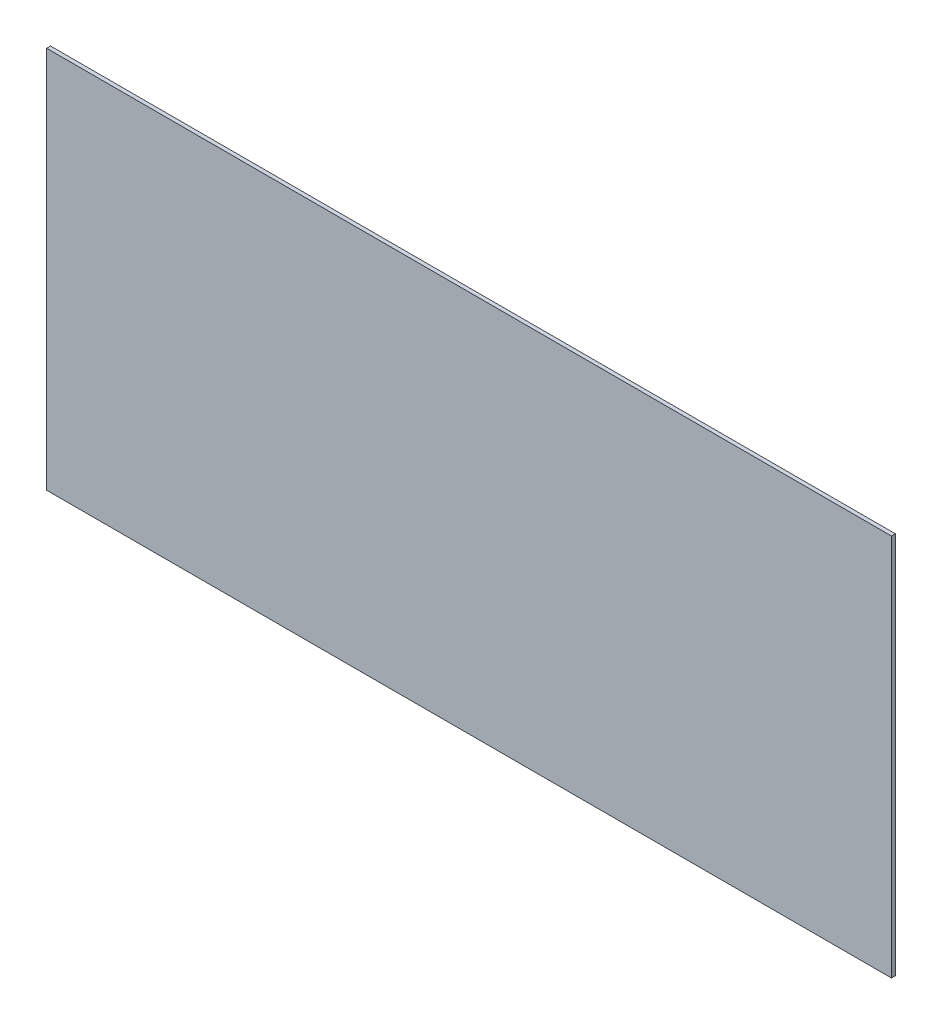
ISO-10303-21;
HEADER;
FILE_DESCRIPTION(('STEP AP214'),'2;1');
FILE_NAME('part.step','',(''),(''),'','','');
FILE_SCHEMA(('AUTOMOTIVE_DESIGN { 1 0 10303 214 1 1 1 1 }'));
ENDSEC;
DATA;
#1=APPLICATION_CONTEXT('core data for automotive mechanical design processes');
#2=APPLICATION_PROTOCOL_DEFINITION('international standard','automotive_design',2000,#1);
#3=PRODUCT_CONTEXT('',#1,'mechanical');
#4=PRODUCT('Part','Part','',(#3));
#5=PRODUCT_RELATED_PRODUCT_CATEGORY('part','',(#4));
#6=PRODUCT_DEFINITION_FORMATION('','',#4);
#7=PRODUCT_DEFINITION_CONTEXT('part definition',#1,'design');
#8=PRODUCT_DEFINITION('design','',#6,#7);
#9=PRODUCT_DEFINITION_SHAPE('','',#8);
#10=(LENGTH_UNIT() NAMED_UNIT(*) SI_UNIT(.MILLI.,.METRE.));
#11=(NAMED_UNIT(*) PLANE_ANGLE_UNIT() SI_UNIT($,.RADIAN.));
#12=(NAMED_UNIT(*) SI_UNIT($,.STERADIAN.) SOLID_ANGLE_UNIT());
#13=UNCERTAINTY_MEASURE_WITH_UNIT(LENGTH_MEASURE(1.E-05),#10,'distance_accuracy_value','');
#14=(GEOMETRIC_REPRESENTATION_CONTEXT(3) GLOBAL_UNCERTAINTY_ASSIGNED_CONTEXT((#13)) GLOBAL_UNIT_ASSIGNED_CONTEXT((#10,
#11,#12)) REPRESENTATION_CONTEXT('',''));
#15=CARTESIAN_POINT('',(0.,0.,0.));
#16=DIRECTION('',(0.,0.,1.));
#17=DIRECTION('',(1.,0.,0.));
#18=AXIS2_PLACEMENT_3D('',#15,#16,#17);
#19=CARTESIAN_POINT('',(172.76,-78.275,1.5875));
#20=DIRECTION('',(-1.,0.,0.));
#21=DIRECTION('',(0.,0.,1.));
#22=AXIS2_PLACEMENT_3D('',#19,#20,#21);
#23=PLANE('',#22);
#24=DIRECTION('',(0.,1.,0.));
#25=VECTOR('',#24,1.);
#26=CARTESIAN_POINT('',(172.76,-78.275,0.));
#27=LINE('',#26,#25);
#28=CARTESIAN_POINT('',(172.76,-78.275,0.));
#29=VERTEX_POINT('',#28);
#30=CARTESIAN_POINT('',(172.76,78.275,0.));
#31=VERTEX_POINT('',#30);
#32=EDGE_CURVE('E111',#29,#31,#27,.T.);
#33=ORIENTED_EDGE('',*,*,#32,.T.);
#34=DIRECTION('',(0.,0.,-1.));
#35=VECTOR('',#34,1.);
#36=CARTESIAN_POINT('',(172.76,78.275,1.5875));
#37=LINE('',#36,#35);
#38=CARTESIAN_POINT('',(172.76,78.275,1.5875));
#39=VERTEX_POINT('',#38);
#40=EDGE_CURVE('E11',#39,#31,#37,.T.);
#41=ORIENTED_EDGE('',*,*,#40,.F.);
#42=DIRECTION('',(0.,1.,0.));
#43=VECTOR('',#42,1.);
#44=CARTESIAN_POINT('',(172.76,-78.275,1.5875));
#45=LINE('',#44,#43);
#46=CARTESIAN_POINT('',(172.76,-78.275,1.5875));
#47=VERTEX_POINT('',#46);
#48=EDGE_CURVE('E95',#47,#39,#45,.T.);
#49=ORIENTED_EDGE('',*,*,#48,.F.);
#50=DIRECTION('',(0.,0.,-1.));
#51=VECTOR('',#50,1.);
#52=CARTESIAN_POINT('',(172.76,-78.275,1.5875));
#53=LINE('',#52,#51);
#54=EDGE_CURVE('E107',#47,#29,#53,.T.);
#55=ORIENTED_EDGE('',*,*,#54,.T.);
#56=EDGE_LOOP('',(#33,#41,#49,#55));
#57=FACE_BOUND('',#56,.T.);
#58=ADVANCED_FACE('F43',(#57),#23,.F.);
#59=CARTESIAN_POINT('',(-172.76,78.275,1.5875));
#60=DIRECTION('',(0.,-1.,0.));
#61=DIRECTION('',(0.,0.,-1.));
#62=AXIS2_PLACEMENT_3D('',#59,#60,#61);
#63=PLANE('',#62);
#64=DIRECTION('',(-1.,0.,0.));
#65=VECTOR('',#64,1.);
#66=CARTESIAN_POINT('',(-172.76,78.275,0.));
#67=LINE('',#66,#65);
#68=CARTESIAN_POINT('',(-172.76,78.275,0.));
#69=VERTEX_POINT('',#68);
#70=EDGE_CURVE('E100',#31,#69,#67,.T.);
#71=ORIENTED_EDGE('',*,*,#70,.T.);
#72=DIRECTION('',(0.,0.,-1.));
#73=VECTOR('',#72,1.);
#74=CARTESIAN_POINT('',(-172.76,78.275,1.5875));
#75=LINE('',#74,#73);
#76=CARTESIAN_POINT('',(-172.76,78.275,1.5875));
#77=VERTEX_POINT('',#76);
#78=EDGE_CURVE('E52',#77,#69,#75,.T.);
#79=ORIENTED_EDGE('',*,*,#78,.F.);
#80=DIRECTION('',(-1.,0.,0.));
#81=VECTOR('',#80,1.);
#82=CARTESIAN_POINT('',(-172.76,78.275,1.5875));
#83=LINE('',#82,#81);
#84=EDGE_CURVE('E90',#39,#77,#83,.T.);
#85=ORIENTED_EDGE('',*,*,#84,.F.);
#86=ORIENTED_EDGE('',*,*,#40,.T.);
#87=EDGE_LOOP('',(#71,#79,#85,#86));
#88=FACE_BOUND('',#87,.T.);
#89=ADVANCED_FACE('F99',(#88),#63,.F.);
#90=CARTESIAN_POINT('',(-172.76,-78.275,1.5875));
#91=DIRECTION('',(1.,0.,0.));
#92=DIRECTION('',(0.,0.,-1.));
#93=AXIS2_PLACEMENT_3D('',#90,#91,#92);
#94=PLANE('',#93);
#95=DIRECTION('',(0.,-1.,0.));
#96=VECTOR('',#95,1.);
#97=CARTESIAN_POINT('',(-172.76,-78.275,0.));
#98=LINE('',#97,#96);
#99=CARTESIAN_POINT('',(-172.76,-78.275,0.));
#100=VERTEX_POINT('',#99);
#101=EDGE_CURVE('E77',#69,#100,#98,.T.);
#102=ORIENTED_EDGE('',*,*,#101,.T.);
#103=DIRECTION('',(0.,0.,-1.));
#104=VECTOR('',#103,1.);
#105=CARTESIAN_POINT('',(-172.76,-78.275,1.5875));
#106=LINE('',#105,#104);
#107=CARTESIAN_POINT('',(-172.76,-78.275,1.5875));
#108=VERTEX_POINT('',#107);
#109=EDGE_CURVE('E102',#108,#100,#106,.T.);
#110=ORIENTED_EDGE('',*,*,#109,.F.);
#111=DIRECTION('',(0.,-1.,0.));
#112=VECTOR('',#111,1.);
#113=CARTESIAN_POINT('',(-172.76,-78.275,1.5875));
#114=LINE('',#113,#112);
#115=EDGE_CURVE('E93',#77,#108,#114,.T.);
#116=ORIENTED_EDGE('',*,*,#115,.F.);
#117=ORIENTED_EDGE('',*,*,#78,.T.);
#118=EDGE_LOOP('',(#102,#110,#116,#117));
#119=FACE_BOUND('',#118,.T.);
#120=ADVANCED_FACE('F103',(#119),#94,.F.);
#121=CARTESIAN_POINT('',(-172.76,-78.275,1.5875));
#122=DIRECTION('',(0.,1.,0.));
#123=DIRECTION('',(0.,0.,1.));
#124=AXIS2_PLACEMENT_3D('',#121,#122,#123);
#125=PLANE('',#124);
#126=DIRECTION('',(1.,0.,0.));
#127=VECTOR('',#126,1.);
#128=CARTESIAN_POINT('',(-172.76,-78.275,0.));
#129=LINE('',#128,#127);
#130=EDGE_CURVE('E83',#100,#29,#129,.T.);
#131=ORIENTED_EDGE('',*,*,#130,.T.);
#132=ORIENTED_EDGE('',*,*,#54,.F.);
#133=DIRECTION('',(1.,0.,0.));
#134=VECTOR('',#133,1.);
#135=CARTESIAN_POINT('',(-172.76,-78.275,1.5875));
#136=LINE('',#135,#134);
#137=EDGE_CURVE('E60',#108,#47,#136,.T.);
#138=ORIENTED_EDGE('',*,*,#137,.F.);
#139=ORIENTED_EDGE('',*,*,#109,.T.);
#140=EDGE_LOOP('',(#131,#132,#138,#139));
#141=FACE_BOUND('',#140,.T.);
#142=ADVANCED_FACE('F124',(#141),#125,.F.);
#143=CARTESIAN_POINT('',(0.,0.,1.5875));
#144=DIRECTION('',(0.,0.,-1.));
#145=DIRECTION('',(-1.,0.,0.));
#146=AXIS2_PLACEMENT_3D('',#143,#144,#145);
#147=PLANE('',#146);
#148=ORIENTED_EDGE('',*,*,#48,.T.);
#149=ORIENTED_EDGE('',*,*,#84,.T.);
#150=ORIENTED_EDGE('',*,*,#115,.T.);
#151=ORIENTED_EDGE('',*,*,#137,.T.);
#152=EDGE_LOOP('',(#148,#149,#150,#151));
#153=FACE_BOUND('',#152,.T.);
#154=ADVANCED_FACE('F91',(#153),#147,.F.);
#155=CARTESIAN_POINT('',(0.,0.,0.));
#156=DIRECTION('',(0.,0.,-1.));
#157=DIRECTION('',(-1.,0.,0.));
#158=AXIS2_PLACEMENT_3D('',#155,#156,#157);
#159=PLANE('',#158);
#160=ORIENTED_EDGE('',*,*,#32,.F.);
#161=ORIENTED_EDGE('',*,*,#130,.F.);
#162=ORIENTED_EDGE('',*,*,#101,.F.);
#163=ORIENTED_EDGE('',*,*,#70,.F.);
#164=EDGE_LOOP('',(#160,#161,#162,#163));
#165=FACE_BOUND('',#164,.T.);
#166=ADVANCED_FACE('F127',(#165),#159,.T.);
#167=CLOSED_SHELL('',(#58,#89,#120,#142,#154,#166));
#168=MANIFOLD_SOLID_BREP('B2',#167);
#169=ADVANCED_BREP_SHAPE_REPRESENTATION('',(#18,#168),#14);
#170=SHAPE_DEFINITION_REPRESENTATION(#9,#169);
ENDSEC;
END-ISO-10303-21;
